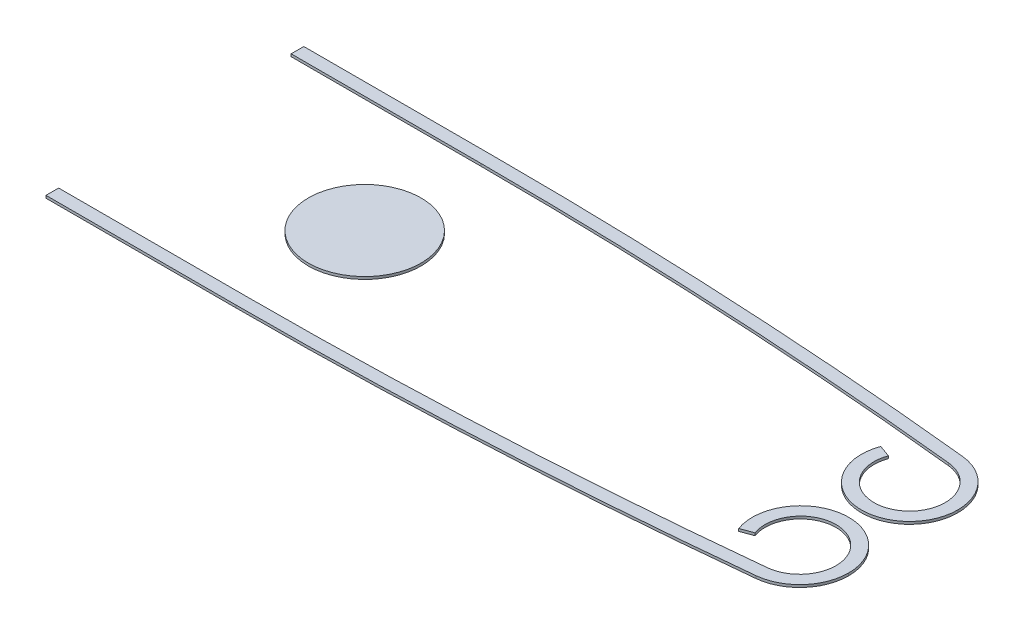
ISO-10303-21;
HEADER;
FILE_DESCRIPTION(('STEP AP214'),'2;1');
FILE_NAME('part.step','',(''),(''),'','','');
FILE_SCHEMA(('AUTOMOTIVE_DESIGN { 1 0 10303 214 1 1 1 1 }'));
ENDSEC;
DATA;
#1=APPLICATION_CONTEXT('core data for automotive mechanical design processes');
#2=APPLICATION_PROTOCOL_DEFINITION('international standard','automotive_design',2000,#1);
#3=PRODUCT_CONTEXT('',#1,'mechanical');
#4=PRODUCT('Part','Part','',(#3));
#5=PRODUCT_RELATED_PRODUCT_CATEGORY('part','',(#4));
#6=PRODUCT_DEFINITION_FORMATION('','',#4);
#7=PRODUCT_DEFINITION_CONTEXT('part definition',#1,'design');
#8=PRODUCT_DEFINITION('design','',#6,#7);
#9=PRODUCT_DEFINITION_SHAPE('','',#8);
#10=(LENGTH_UNIT() NAMED_UNIT(*) SI_UNIT(.MILLI.,.METRE.));
#11=(NAMED_UNIT(*) PLANE_ANGLE_UNIT() SI_UNIT($,.RADIAN.));
#12=(NAMED_UNIT(*) SI_UNIT($,.STERADIAN.) SOLID_ANGLE_UNIT());
#13=UNCERTAINTY_MEASURE_WITH_UNIT(LENGTH_MEASURE(1.E-05),#10,'distance_accuracy_value','');
#14=(GEOMETRIC_REPRESENTATION_CONTEXT(3) GLOBAL_UNCERTAINTY_ASSIGNED_CONTEXT((#13)) GLOBAL_UNIT_ASSIGNED_CONTEXT((#10,
#11,#12)) REPRESENTATION_CONTEXT('',''));
#15=CARTESIAN_POINT('',(0.,0.,0.));
#16=DIRECTION('',(0.,0.,1.));
#17=DIRECTION('',(1.,0.,0.));
#18=AXIS2_PLACEMENT_3D('',#15,#16,#17);
#19=CARTESIAN_POINT('',(193.75,0.5,21.55));
#20=DIRECTION('',(0.,-1.,0.));
#21=DIRECTION('',(0.,0.,-1.));
#22=AXIS2_PLACEMENT_3D('',#19,#20,#21);
#23=CYLINDRICAL_SURFACE('',#22,19.05);
#24=CARTESIAN_POINT('',(193.75,-0.5,21.55));
#25=DIRECTION('',(0.,1.,0.));
#26=DIRECTION('',(0.,0.,1.));
#27=AXIS2_PLACEMENT_3D('',#24,#25,#26);
#28=CIRCLE('',#27,19.05);
#29=CARTESIAN_POINT('',(212.8,-0.5,21.55));
#30=VERTEX_POINT('',#29);
#31=CARTESIAN_POINT('',(175.848518066115,-0.5,28.0645563602443));
#32=VERTEX_POINT('',#31);
#33=EDGE_CURVE('E150',#30,#32,#28,.T.);
#34=ORIENTED_EDGE('',*,*,#33,.T.);
#35=DIRECTION('',(0.,-1.,0.));
#36=VECTOR('',#35,1.);
#37=CARTESIAN_POINT('',(175.848518066115,0.5,28.0645563602443));
#38=LINE('',#37,#36);
#39=CARTESIAN_POINT('',(175.848518066115,0.5,28.0645563602443));
#40=VERTEX_POINT('',#39);
#41=EDGE_CURVE('E12',#40,#32,#38,.T.);
#42=ORIENTED_EDGE('',*,*,#41,.F.);
#43=CARTESIAN_POINT('',(193.75,0.5,21.55));
#44=DIRECTION('',(0.,1.,0.));
#45=DIRECTION('',(0.,0.,1.));
#46=AXIS2_PLACEMENT_3D('',#43,#44,#45);
#47=CIRCLE('',#46,19.05);
#48=CARTESIAN_POINT('',(212.8,0.5,21.55));
#49=VERTEX_POINT('',#48);
#50=EDGE_CURVE('E168',#49,#40,#47,.T.);
#51=ORIENTED_EDGE('',*,*,#50,.F.);
#52=DIRECTION('',(0.,-1.,0.));
#53=VECTOR('',#52,1.);
#54=CARTESIAN_POINT('',(212.8,0.5,21.55));
#55=LINE('',#54,#53);
#56=EDGE_CURVE('E146',#49,#30,#55,.T.);
#57=ORIENTED_EDGE('',*,*,#56,.T.);
#58=EDGE_LOOP('',(#34,#42,#51,#57));
#59=FACE_BOUND('',#58,.T.);
#60=ADVANCED_FACE('F42',(#59),#23,.T.);
#61=CARTESIAN_POINT('',(180.547069754799,0.5,26.3546990478442));
#62=DIRECTION('',(-0.341971462480017,0.,-0.93971033773673));
#63=DIRECTION('',(-0.93971033773673,0.,0.341971462480017));
#64=AXIS2_PLACEMENT_3D('',#61,#62,#63);
#65=PLANE('',#64);
#66=DIRECTION('',(0.93971033773673,0.,-0.341971462480017));
#67=VECTOR('',#66,1.);
#68=CARTESIAN_POINT('',(180.547069754799,-0.5,26.3546990478442));
#69=LINE('',#68,#67);
#70=CARTESIAN_POINT('',(180.547069754799,-0.5,26.3546990478442));
#71=VERTEX_POINT('',#70);
#72=EDGE_CURVE('E153',#32,#71,#69,.T.);
#73=ORIENTED_EDGE('',*,*,#72,.T.);
#74=DIRECTION('',(0.,-1.,0.));
#75=VECTOR('',#74,1.);
#76=CARTESIAN_POINT('',(180.547069754799,0.5,26.3546990478442));
#77=LINE('',#76,#75);
#78=CARTESIAN_POINT('',(180.547069754799,0.5,26.3546990478442));
#79=VERTEX_POINT('',#78);
#80=EDGE_CURVE('E50',#79,#71,#77,.T.);
#81=ORIENTED_EDGE('',*,*,#80,.F.);
#82=DIRECTION('',(0.93971033773673,0.,-0.341971462480017));
#83=VECTOR('',#82,1.);
#84=CARTESIAN_POINT('',(180.547069754799,0.5,26.3546990478442));
#85=LINE('',#84,#83);
#86=EDGE_CURVE('E107',#40,#79,#85,.T.);
#87=ORIENTED_EDGE('',*,*,#86,.F.);
#88=ORIENTED_EDGE('',*,*,#41,.T.);
#89=EDGE_LOOP('',(#73,#81,#87,#88));
#90=FACE_BOUND('',#89,.T.);
#91=ADVANCED_FACE('F217',(#90),#65,.F.);
#92=CARTESIAN_POINT('',(193.75,0.5,21.55));
#93=DIRECTION('',(0.,-1.,0.));
#94=DIRECTION('',(0.,0.,-1.));
#95=AXIS2_PLACEMENT_3D('',#92,#93,#94);
#96=CYLINDRICAL_SURFACE('',#95,14.05);
#97=CARTESIAN_POINT('',(193.75,-0.5,21.55));
#98=DIRECTION('',(0.,-1.,0.));
#99=DIRECTION('',(0.,0.,1.));
#100=AXIS2_PLACEMENT_3D('',#97,#98,#99);
#101=CIRCLE('',#100,14.05);
#102=CARTESIAN_POINT('',(207.8,-0.5,21.55));
#103=VERTEX_POINT('',#102);
#104=EDGE_CURVE('E155',#71,#103,#101,.T.);
#105=ORIENTED_EDGE('',*,*,#104,.T.);
#106=DIRECTION('',(0.,-1.,0.));
#107=VECTOR('',#106,1.);
#108=CARTESIAN_POINT('',(207.8,0.5,21.55));
#109=LINE('',#108,#107);
#110=CARTESIAN_POINT('',(207.8,0.5,21.55));
#111=VERTEX_POINT('',#110);
#112=EDGE_CURVE('E181',#111,#103,#109,.T.);
#113=ORIENTED_EDGE('',*,*,#112,.F.);
#114=CARTESIAN_POINT('',(193.75,0.5,21.55));
#115=DIRECTION('',(0.,-1.,0.));
#116=DIRECTION('',(0.,0.,1.));
#117=AXIS2_PLACEMENT_3D('',#114,#115,#116);
#118=CIRCLE('',#117,14.05);
#119=EDGE_CURVE('E189',#79,#111,#118,.T.);
#120=ORIENTED_EDGE('',*,*,#119,.F.);
#121=ORIENTED_EDGE('',*,*,#80,.T.);
#122=EDGE_LOOP('',(#105,#113,#120,#121));
#123=FACE_BOUND('',#122,.T.);
#124=ADVANCED_FACE('F187',(#123),#96,.F.);
#125=CARTESIAN_POINT('',(193.442155370501,0.5,21.55));
#126=DIRECTION('',(0.,-1.,0.));
#127=DIRECTION('',(0.,0.,-1.));
#128=AXIS2_PLACEMENT_3D('',#125,#126,#127);
#129=CYLINDRICAL_SURFACE('',#128,14.357844629499);
#130=CARTESIAN_POINT('',(193.442155370501,-0.5,21.55));
#131=DIRECTION('',(0.,-1.,0.));
#132=DIRECTION('',(0.,0.,1.));
#133=AXIS2_PLACEMENT_3D('',#130,#131,#132);
#134=CIRCLE('',#133,14.357844629499);
#135=CARTESIAN_POINT('',(194.926198619889,-0.5,35.830942477259));
#136=VERTEX_POINT('',#135);
#137=EDGE_CURVE('E157',#103,#136,#134,.T.);
#138=ORIENTED_EDGE('',*,*,#137,.T.);
#139=DIRECTION('',(0.,-1.,0.));
#140=VECTOR('',#139,1.);
#141=CARTESIAN_POINT('',(194.926198619889,0.5,35.830942477259));
#142=LINE('',#141,#140);
#143=CARTESIAN_POINT('',(194.926198619889,0.5,35.830942477259));
#144=VERTEX_POINT('',#143);
#145=EDGE_CURVE('E178',#144,#136,#142,.T.);
#146=ORIENTED_EDGE('',*,*,#145,.F.);
#147=CARTESIAN_POINT('',(193.442155370501,0.5,21.55));
#148=DIRECTION('',(0.,-1.,0.));
#149=DIRECTION('',(0.,0.,1.));
#150=AXIS2_PLACEMENT_3D('',#147,#148,#149);
#151=CIRCLE('',#150,14.357844629499);
#152=EDGE_CURVE('E207',#111,#144,#151,.T.);
#153=ORIENTED_EDGE('',*,*,#152,.F.);
#154=ORIENTED_EDGE('',*,*,#112,.T.);
#155=EDGE_LOOP('',(#138,#146,#153,#154));
#156=FACE_BOUND('',#155,.T.);
#157=ADVANCED_FACE('F198',(#156),#129,.F.);
#158=CARTESIAN_POINT('',(0.,0.5,-1839.94311663476));
#159=DIRECTION('',(0.,-1.,0.));
#160=DIRECTION('',(0.,0.,-1.));
#161=AXIS2_PLACEMENT_3D('',#158,#159,#160);
#162=CYLINDRICAL_SURFACE('',#161,1885.87500745568);
#163=CARTESIAN_POINT('',(0.,-0.5,-1839.94311663476));
#164=DIRECTION('',(0.,-1.,0.));
#165=DIRECTION('',(0.,0.,1.));
#166=AXIS2_PLACEMENT_3D('',#163,#164,#165);
#167=CIRCLE('',#166,1885.87500745568);
#168=CARTESIAN_POINT('',(0.,-0.5,45.931890820925));
#169=VERTEX_POINT('',#168);
#170=EDGE_CURVE('E159',#136,#169,#167,.T.);
#171=ORIENTED_EDGE('',*,*,#170,.T.);
#172=DIRECTION('',(0.,-1.,0.));
#173=VECTOR('',#172,1.);
#174=CARTESIAN_POINT('',(0.,0.5,45.931890820925));
#175=LINE('',#174,#173);
#176=CARTESIAN_POINT('',(0.,0.5,45.931890820925));
#177=VERTEX_POINT('',#176);
#178=EDGE_CURVE('E175',#177,#169,#175,.T.);
#179=ORIENTED_EDGE('',*,*,#178,.F.);
#180=CARTESIAN_POINT('',(0.,0.5,-1839.94311663476));
#181=DIRECTION('',(0.,-1.,0.));
#182=DIRECTION('',(0.,0.,1.));
#183=AXIS2_PLACEMENT_3D('',#180,#181,#182);
#184=CIRCLE('',#183,1885.87500745568);
#185=EDGE_CURVE('E204',#144,#177,#184,.T.);
#186=ORIENTED_EDGE('',*,*,#185,.F.);
#187=ORIENTED_EDGE('',*,*,#145,.T.);
#188=EDGE_LOOP('',(#171,#179,#186,#187));
#189=FACE_BOUND('',#188,.T.);
#190=ADVANCED_FACE('F202',(#189),#162,.F.);
#191=CARTESIAN_POINT('',(-3.03271831394858E-13,0.5,45.931890820925));
#192=DIRECTION('',(0.,0.,1.));
#193=DIRECTION('',(1.,0.,0.));
#194=AXIS2_PLACEMENT_3D('',#191,#192,#193);
#195=PLANE('',#194);
#196=DIRECTION('',(-1.,0.,0.));
#197=VECTOR('',#196,1.);
#198=CARTESIAN_POINT('',(-3.03271831394858E-13,-0.5,45.931890820925));
#199=LINE('',#198,#197);
#200=CARTESIAN_POINT('',(-75.0000000000002,-0.5,45.9318908209251));
#201=VERTEX_POINT('',#200);
#202=EDGE_CURVE('E161',#169,#201,#199,.T.);
#203=ORIENTED_EDGE('',*,*,#202,.T.);
#204=DIRECTION('',(0.,-1.,0.));
#205=VECTOR('',#204,1.);
#206=CARTESIAN_POINT('',(-75.0000000000002,0.5,45.9318908209251));
#207=LINE('',#206,#205);
#208=CARTESIAN_POINT('',(-75.0000000000002,0.5,45.9318908209251));
#209=VERTEX_POINT('',#208);
#210=EDGE_CURVE('E172',#209,#201,#207,.T.);
#211=ORIENTED_EDGE('',*,*,#210,.F.);
#212=DIRECTION('',(-1.,0.,0.));
#213=VECTOR('',#212,1.);
#214=CARTESIAN_POINT('',(-3.03271831394858E-13,0.5,45.931890820925));
#215=LINE('',#214,#213);
#216=EDGE_CURVE('E206',#177,#209,#215,.T.);
#217=ORIENTED_EDGE('',*,*,#216,.F.);
#218=ORIENTED_EDGE('',*,*,#178,.T.);
#219=EDGE_LOOP('',(#203,#211,#217,#218));
#220=FACE_BOUND('',#219,.T.);
#221=ADVANCED_FACE('F229',(#220),#195,.F.);
#222=CARTESIAN_POINT('',(-75.0000000000002,0.5,50.9318908209252));
#223=DIRECTION('',(1.,0.,0.));
#224=DIRECTION('',(0.,0.,-1.));
#225=AXIS2_PLACEMENT_3D('',#222,#223,#224);
#226=PLANE('',#225);
#227=DIRECTION('',(0.,0.,1.));
#228=VECTOR('',#227,1.);
#229=CARTESIAN_POINT('',(-75.0000000000002,-0.5,50.9318908209252));
#230=LINE('',#229,#228);
#231=CARTESIAN_POINT('',(-75.0000000000002,-0.5,50.9318908209252));
#232=VERTEX_POINT('',#231);
#233=EDGE_CURVE('E163',#201,#232,#230,.T.);
#234=ORIENTED_EDGE('',*,*,#233,.T.);
#235=DIRECTION('',(0.,-1.,0.));
#236=VECTOR('',#235,1.);
#237=CARTESIAN_POINT('',(-75.0000000000002,0.5,50.9318908209252));
#238=LINE('',#237,#236);
#239=CARTESIAN_POINT('',(-75.0000000000002,0.5,50.9318908209252));
#240=VERTEX_POINT('',#239);
#241=EDGE_CURVE('E141',#240,#232,#238,.T.);
#242=ORIENTED_EDGE('',*,*,#241,.F.);
#243=DIRECTION('',(0.,0.,1.));
#244=VECTOR('',#243,1.);
#245=CARTESIAN_POINT('',(-75.0000000000002,0.5,50.9318908209252));
#246=LINE('',#245,#244);
#247=EDGE_CURVE('E132',#209,#240,#246,.T.);
#248=ORIENTED_EDGE('',*,*,#247,.F.);
#249=ORIENTED_EDGE('',*,*,#210,.T.);
#250=EDGE_LOOP('',(#234,#242,#248,#249));
#251=FACE_BOUND('',#250,.T.);
#252=ADVANCED_FACE('F232',(#251),#226,.F.);
#253=CARTESIAN_POINT('',(-2.31565402546833E-13,0.5,50.9318908209251));
#254=DIRECTION('',(0.,0.,-1.));
#255=DIRECTION('',(-1.,0.,0.));
#256=AXIS2_PLACEMENT_3D('',#253,#254,#255);
#257=PLANE('',#256);
#258=DIRECTION('',(1.,0.,0.));
#259=VECTOR('',#258,1.);
#260=CARTESIAN_POINT('',(-2.31565402546833E-13,-0.5,50.9318908209251));
#261=LINE('',#260,#259);
#262=CARTESIAN_POINT('',(-2.31565402546833E-13,-0.5,50.9318908209251));
#263=VERTEX_POINT('',#262);
#264=EDGE_CURVE('E140',#232,#263,#261,.T.);
#265=ORIENTED_EDGE('',*,*,#264,.T.);
#266=DIRECTION('',(0.,-1.,0.));
#267=VECTOR('',#266,1.);
#268=CARTESIAN_POINT('',(-2.31565402546833E-13,0.5,50.9318908209251));
#269=LINE('',#268,#267);
#270=CARTESIAN_POINT('',(-2.31565402546833E-13,0.5,50.9318908209251));
#271=VERTEX_POINT('',#270);
#272=EDGE_CURVE('E137',#271,#263,#269,.T.);
#273=ORIENTED_EDGE('',*,*,#272,.F.);
#274=DIRECTION('',(1.,0.,0.));
#275=VECTOR('',#274,1.);
#276=CARTESIAN_POINT('',(-2.31565402546833E-13,0.5,50.9318908209251));
#277=LINE('',#276,#275);
#278=EDGE_CURVE('E126',#240,#271,#277,.T.);
#279=ORIENTED_EDGE('',*,*,#278,.F.);
#280=ORIENTED_EDGE('',*,*,#241,.T.);
#281=EDGE_LOOP('',(#265,#273,#279,#280));
#282=FACE_BOUND('',#281,.T.);
#283=ADVANCED_FACE('F138',(#282),#257,.F.);
#284=CARTESIAN_POINT('',(0.,0.5,-1839.94311663476));
#285=DIRECTION('',(0.,-1.,0.));
#286=DIRECTION('',(0.,0.,-1.));
#287=AXIS2_PLACEMENT_3D('',#284,#285,#286);
#288=CYLINDRICAL_SURFACE('',#287,1890.87500745568);
#289=CARTESIAN_POINT('',(0.,-0.5,-1839.94311663476));
#290=DIRECTION('',(0.,1.,0.));
#291=DIRECTION('',(0.,0.,1.));
#292=AXIS2_PLACEMENT_3D('',#289,#290,#291);
#293=CIRCLE('',#292,1890.87500745568);
#294=CARTESIAN_POINT('',(195.443004340971,-0.5,40.8041619422186));
#295=VERTEX_POINT('',#294);
#296=EDGE_CURVE('E93',#263,#295,#293,.T.);
#297=ORIENTED_EDGE('',*,*,#296,.T.);
#298=DIRECTION('',(0.,-1.,0.));
#299=VECTOR('',#298,1.);
#300=CARTESIAN_POINT('',(195.443004340971,0.5,40.8041619422186));
#301=LINE('',#300,#299);
#302=CARTESIAN_POINT('',(195.443004340971,0.5,40.8041619422186));
#303=VERTEX_POINT('',#302);
#304=EDGE_CURVE('E142',#303,#295,#301,.T.);
#305=ORIENTED_EDGE('',*,*,#304,.F.);
#306=CARTESIAN_POINT('',(0.,0.5,-1839.94311663476));
#307=DIRECTION('',(0.,1.,0.));
#308=DIRECTION('',(0.,0.,1.));
#309=AXIS2_PLACEMENT_3D('',#306,#307,#308);
#310=CIRCLE('',#309,1890.87500745568);
#311=EDGE_CURVE('E130',#271,#303,#310,.T.);
#312=ORIENTED_EDGE('',*,*,#311,.F.);
#313=ORIENTED_EDGE('',*,*,#272,.T.);
#314=EDGE_LOOP('',(#297,#305,#312,#313));
#315=FACE_BOUND('',#314,.T.);
#316=ADVANCED_FACE('F144',(#315),#288,.T.);
#317=CARTESIAN_POINT('',(193.442155370501,0.5,21.55));
#318=DIRECTION('',(0.,-1.,0.));
#319=DIRECTION('',(0.,0.,-1.));
#320=AXIS2_PLACEMENT_3D('',#317,#318,#319);
#321=CYLINDRICAL_SURFACE('',#320,19.3578446294989);
#322=CARTESIAN_POINT('',(193.442155370501,-0.5,21.55));
#323=DIRECTION('',(0.,1.,0.));
#324=DIRECTION('',(0.,0.,1.));
#325=AXIS2_PLACEMENT_3D('',#322,#323,#324);
#326=CIRCLE('',#325,19.3578446294989);
#327=EDGE_CURVE('E99',#295,#30,#326,.T.);
#328=ORIENTED_EDGE('',*,*,#327,.T.);
#329=ORIENTED_EDGE('',*,*,#56,.F.);
#330=CARTESIAN_POINT('',(193.442155370501,0.5,21.55));
#331=DIRECTION('',(0.,1.,0.));
#332=DIRECTION('',(0.,0.,1.));
#333=AXIS2_PLACEMENT_3D('',#330,#331,#332);
#334=CIRCLE('',#333,19.3578446294989);
#335=EDGE_CURVE('E58',#303,#49,#334,.T.);
#336=ORIENTED_EDGE('',*,*,#335,.F.);
#337=ORIENTED_EDGE('',*,*,#304,.T.);
#338=EDGE_LOOP('',(#328,#329,#336,#337));
#339=FACE_BOUND('',#338,.T.);
#340=ADVANCED_FACE('F241',(#339),#321,.T.);
#341=CARTESIAN_POINT('',(193.75,0.5,21.55));
#342=DIRECTION('',(0.,1.,0.));
#343=DIRECTION('',(0.,0.,1.));
#344=AXIS2_PLACEMENT_3D('',#341,#342,#343);
#345=PLANE('',#344);
#346=ORIENTED_EDGE('',*,*,#50,.T.);
#347=ORIENTED_EDGE('',*,*,#86,.T.);
#348=ORIENTED_EDGE('',*,*,#119,.T.);
#349=ORIENTED_EDGE('',*,*,#152,.T.);
#350=ORIENTED_EDGE('',*,*,#185,.T.);
#351=ORIENTED_EDGE('',*,*,#216,.T.);
#352=ORIENTED_EDGE('',*,*,#247,.T.);
#353=ORIENTED_EDGE('',*,*,#278,.T.);
#354=ORIENTED_EDGE('',*,*,#311,.T.);
#355=ORIENTED_EDGE('',*,*,#335,.T.);
#356=EDGE_LOOP('',(#346,#347,#348,#349,#350,#351,#352,#353,#354,#355));
#357=FACE_BOUND('',#356,.T.);
#358=ADVANCED_FACE('F128',(#357),#345,.T.);
#359=CARTESIAN_POINT('',(193.75,-0.5,21.55));
#360=DIRECTION('',(0.,1.,0.));
#361=DIRECTION('',(0.,0.,1.));
#362=AXIS2_PLACEMENT_3D('',#359,#360,#361);
#363=PLANE('',#362);
#364=ORIENTED_EDGE('',*,*,#33,.F.);
#365=ORIENTED_EDGE('',*,*,#327,.F.);
#366=ORIENTED_EDGE('',*,*,#296,.F.);
#367=ORIENTED_EDGE('',*,*,#264,.F.);
#368=ORIENTED_EDGE('',*,*,#233,.F.);
#369=ORIENTED_EDGE('',*,*,#202,.F.);
#370=ORIENTED_EDGE('',*,*,#170,.F.);
#371=ORIENTED_EDGE('',*,*,#137,.F.);
#372=ORIENTED_EDGE('',*,*,#104,.F.);
#373=ORIENTED_EDGE('',*,*,#72,.F.);
#374=EDGE_LOOP('',(#364,#365,#366,#367,#368,#369,#370,#371,#372,#373));
#375=FACE_BOUND('',#374,.T.);
#376=ADVANCED_FACE('F193',(#375),#363,.F.);
#377=CLOSED_SHELL('',(#60,#91,#124,#157,#190,#221,#252,#283,#316,#340,#358,#376));
#378=MANIFOLD_SOLID_BREP('B2',#377);
#379=CARTESIAN_POINT('',(0.,0.5,1839.94311663476));
#380=DIRECTION('',(0.,-1.,0.));
#381=DIRECTION('',(0.,0.,-1.));
#382=AXIS2_PLACEMENT_3D('',#379,#380,#381);
#383=CYLINDRICAL_SURFACE('',#382,1890.87500745568);
#384=CARTESIAN_POINT('',(0.,-0.5,1839.94311663476));
#385=DIRECTION('',(0.,1.,0.));
#386=DIRECTION('',(0.,0.,-1.));
#387=AXIS2_PLACEMENT_3D('',#384,#385,#386);
#388=CIRCLE('',#387,1890.87500745568);
#389=CARTESIAN_POINT('',(195.443004340971,-0.5,-40.8041619422188));
#390=VERTEX_POINT('',#389);
#391=CARTESIAN_POINT('',(-2.31565402546833E-13,-0.5,-50.9318908209251));
#392=VERTEX_POINT('',#391);
#393=EDGE_CURVE('E437',#390,#392,#388,.T.);
#394=ORIENTED_EDGE('',*,*,#393,.T.);
#395=DIRECTION('',(0.,-1.,0.));
#396=VECTOR('',#395,1.);
#397=CARTESIAN_POINT('',(-2.31565402546833E-13,0.5,-50.9318908209251));
#398=LINE('',#397,#396);
#399=CARTESIAN_POINT('',(-2.31565402546833E-13,0.5,-50.9318908209251));
#400=VERTEX_POINT('',#399);
#401=EDGE_CURVE('E40',#400,#392,#398,.T.);
#402=ORIENTED_EDGE('',*,*,#401,.F.);
#403=CARTESIAN_POINT('',(0.,0.5,1839.94311663476));
#404=DIRECTION('',(0.,1.,0.));
#405=DIRECTION('',(0.,0.,-1.));
#406=AXIS2_PLACEMENT_3D('',#403,#404,#405);
#407=CIRCLE('',#406,1890.87500745568);
#408=CARTESIAN_POINT('',(195.443004340971,0.5,-40.8041619422188));
#409=VERTEX_POINT('',#408);
#410=EDGE_CURVE('E455',#409,#400,#407,.T.);
#411=ORIENTED_EDGE('',*,*,#410,.F.);
#412=DIRECTION('',(0.,-1.,0.));
#413=VECTOR('',#412,1.);
#414=CARTESIAN_POINT('',(195.443004340971,0.5,-40.8041619422188));
#415=LINE('',#414,#413);
#416=EDGE_CURVE('E433',#409,#390,#415,.T.);
#417=ORIENTED_EDGE('',*,*,#416,.T.);
#418=EDGE_LOOP('',(#394,#402,#411,#417));
#419=FACE_BOUND('',#418,.T.);
#420=ADVANCED_FACE('F329',(#419),#383,.T.);
#421=CARTESIAN_POINT('',(-2.31565402546833E-13,0.5,-50.9318908209251));
#422=DIRECTION('',(0.,0.,1.));
#423=DIRECTION('',(1.,0.,0.));
#424=AXIS2_PLACEMENT_3D('',#421,#422,#423);
#425=PLANE('',#424);
#426=DIRECTION('',(-1.,0.,0.));
#427=VECTOR('',#426,1.);
#428=CARTESIAN_POINT('',(-2.31565402546833E-13,-0.5,-50.9318908209251));
#429=LINE('',#428,#427);
#430=CARTESIAN_POINT('',(-75.0000000000002,-0.5,-50.9318908209252));
#431=VERTEX_POINT('',#430);
#432=EDGE_CURVE('E440',#392,#431,#429,.T.);
#433=ORIENTED_EDGE('',*,*,#432,.T.);
#434=DIRECTION('',(0.,-1.,0.));
#435=VECTOR('',#434,1.);
#436=CARTESIAN_POINT('',(-75.0000000000002,0.5,-50.9318908209252));
#437=LINE('',#436,#435);
#438=CARTESIAN_POINT('',(-75.0000000000002,0.5,-50.9318908209252));
#439=VERTEX_POINT('',#438);
#440=EDGE_CURVE('E337',#439,#431,#437,.T.);
#441=ORIENTED_EDGE('',*,*,#440,.F.);
#442=DIRECTION('',(-1.,0.,0.));
#443=VECTOR('',#442,1.);
#444=CARTESIAN_POINT('',(-2.31565402546833E-13,0.5,-50.9318908209251));
#445=LINE('',#444,#443);
#446=EDGE_CURVE('E394',#400,#439,#445,.T.);
#447=ORIENTED_EDGE('',*,*,#446,.F.);
#448=ORIENTED_EDGE('',*,*,#401,.T.);
#449=EDGE_LOOP('',(#433,#441,#447,#448));
#450=FACE_BOUND('',#449,.T.);
#451=ADVANCED_FACE('F504',(#450),#425,.F.);
#452=CARTESIAN_POINT('',(-75.0000000000002,0.5,-50.9318908209252));
#453=DIRECTION('',(1.,0.,0.));
#454=DIRECTION('',(0.,0.,-1.));
#455=AXIS2_PLACEMENT_3D('',#452,#453,#454);
#456=PLANE('',#455);
#457=DIRECTION('',(0.,0.,1.));
#458=VECTOR('',#457,1.);
#459=CARTESIAN_POINT('',(-75.0000000000002,-0.5,-50.9318908209252));
#460=LINE('',#459,#458);
#461=CARTESIAN_POINT('',(-75.0000000000002,-0.5,-45.9318908209251));
#462=VERTEX_POINT('',#461);
#463=EDGE_CURVE('E442',#431,#462,#460,.T.);
#464=ORIENTED_EDGE('',*,*,#463,.T.);
#465=DIRECTION('',(0.,-1.,0.));
#466=VECTOR('',#465,1.);
#467=CARTESIAN_POINT('',(-75.0000000000002,0.5,-45.9318908209251));
#468=LINE('',#467,#466);
#469=CARTESIAN_POINT('',(-75.0000000000002,0.5,-45.9318908209251));
#470=VERTEX_POINT('',#469);
#471=EDGE_CURVE('E468',#470,#462,#468,.T.);
#472=ORIENTED_EDGE('',*,*,#471,.F.);
#473=DIRECTION('',(0.,0.,1.));
#474=VECTOR('',#473,1.);
#475=CARTESIAN_POINT('',(-75.0000000000002,0.5,-50.9318908209252));
#476=LINE('',#475,#474);
#477=EDGE_CURVE('E476',#439,#470,#476,.T.);
#478=ORIENTED_EDGE('',*,*,#477,.F.);
#479=ORIENTED_EDGE('',*,*,#440,.T.);
#480=EDGE_LOOP('',(#464,#472,#478,#479));
#481=FACE_BOUND('',#480,.T.);
#482=ADVANCED_FACE('F474',(#481),#456,.F.);
#483=CARTESIAN_POINT('',(-3.03271831394858E-13,0.5,-45.931890820925));
#484=DIRECTION('',(0.,0.,-1.));
#485=DIRECTION('',(-1.,0.,0.));
#486=AXIS2_PLACEMENT_3D('',#483,#484,#485);
#487=PLANE('',#486);
#488=DIRECTION('',(1.,0.,0.));
#489=VECTOR('',#488,1.);
#490=CARTESIAN_POINT('',(-3.03271831394858E-13,-0.5,-45.931890820925));
#491=LINE('',#490,#489);
#492=CARTESIAN_POINT('',(-3.03271831394858E-13,-0.5,-45.931890820925));
#493=VERTEX_POINT('',#492);
#494=EDGE_CURVE('E444',#462,#493,#491,.T.);
#495=ORIENTED_EDGE('',*,*,#494,.T.);
#496=DIRECTION('',(0.,-1.,0.));
#497=VECTOR('',#496,1.);
#498=CARTESIAN_POINT('',(-3.03271831394858E-13,0.5,-45.931890820925));
#499=LINE('',#498,#497);
#500=CARTESIAN_POINT('',(-3.03271831394858E-13,0.5,-45.931890820925));
#501=VERTEX_POINT('',#500);
#502=EDGE_CURVE('E465',#501,#493,#499,.T.);
#503=ORIENTED_EDGE('',*,*,#502,.F.);
#504=DIRECTION('',(1.,0.,0.));
#505=VECTOR('',#504,1.);
#506=CARTESIAN_POINT('',(-3.03271831394858E-13,0.5,-45.931890820925));
#507=LINE('',#506,#505);
#508=EDGE_CURVE('E494',#470,#501,#507,.T.);
#509=ORIENTED_EDGE('',*,*,#508,.F.);
#510=ORIENTED_EDGE('',*,*,#471,.T.);
#511=EDGE_LOOP('',(#495,#503,#509,#510));
#512=FACE_BOUND('',#511,.T.);
#513=ADVANCED_FACE('F485',(#512),#487,.F.);
#514=CARTESIAN_POINT('',(0.,0.5,1839.94311663476));
#515=DIRECTION('',(0.,-1.,0.));
#516=DIRECTION('',(0.,0.,-1.));
#517=AXIS2_PLACEMENT_3D('',#514,#515,#516);
#518=CYLINDRICAL_SURFACE('',#517,1885.87500745568);
#519=CARTESIAN_POINT('',(0.,-0.5,1839.94311663476));
#520=DIRECTION('',(0.,-1.,0.));
#521=DIRECTION('',(0.,0.,-1.));
#522=AXIS2_PLACEMENT_3D('',#519,#520,#521);
#523=CIRCLE('',#522,1885.87500745568);
#524=CARTESIAN_POINT('',(194.926198619889,-0.5,-35.8309424772587));
#525=VERTEX_POINT('',#524);
#526=EDGE_CURVE('E446',#493,#525,#523,.T.);
#527=ORIENTED_EDGE('',*,*,#526,.T.);
#528=DIRECTION('',(0.,-1.,0.));
#529=VECTOR('',#528,1.);
#530=CARTESIAN_POINT('',(194.926198619889,0.5,-35.8309424772587));
#531=LINE('',#530,#529);
#532=CARTESIAN_POINT('',(194.926198619889,0.5,-35.8309424772587));
#533=VERTEX_POINT('',#532);
#534=EDGE_CURVE('E462',#533,#525,#531,.T.);
#535=ORIENTED_EDGE('',*,*,#534,.F.);
#536=CARTESIAN_POINT('',(0.,0.5,1839.94311663476));
#537=DIRECTION('',(0.,-1.,0.));
#538=DIRECTION('',(0.,0.,-1.));
#539=AXIS2_PLACEMENT_3D('',#536,#537,#538);
#540=CIRCLE('',#539,1885.87500745568);
#541=EDGE_CURVE('E491',#501,#533,#540,.T.);
#542=ORIENTED_EDGE('',*,*,#541,.F.);
#543=ORIENTED_EDGE('',*,*,#502,.T.);
#544=EDGE_LOOP('',(#527,#535,#542,#543));
#545=FACE_BOUND('',#544,.T.);
#546=ADVANCED_FACE('F489',(#545),#518,.F.);
#547=CARTESIAN_POINT('',(193.442155370501,0.5,-21.55));
#548=DIRECTION('',(0.,-1.,0.));
#549=DIRECTION('',(0.,0.,-1.));
#550=AXIS2_PLACEMENT_3D('',#547,#548,#549);
#551=CYLINDRICAL_SURFACE('',#550,14.357844629499);
#552=CARTESIAN_POINT('',(193.442155370501,-0.5,-21.55));
#553=DIRECTION('',(0.,-1.,0.));
#554=DIRECTION('',(0.,0.,-1.));
#555=AXIS2_PLACEMENT_3D('',#552,#553,#554);
#556=CIRCLE('',#555,14.357844629499);
#557=CARTESIAN_POINT('',(207.8,-0.5,-21.55));
#558=VERTEX_POINT('',#557);
#559=EDGE_CURVE('E448',#525,#558,#556,.T.);
#560=ORIENTED_EDGE('',*,*,#559,.T.);
#561=DIRECTION('',(0.,-1.,0.));
#562=VECTOR('',#561,1.);
#563=CARTESIAN_POINT('',(207.8,0.5,-21.55));
#564=LINE('',#563,#562);
#565=CARTESIAN_POINT('',(207.8,0.5,-21.55));
#566=VERTEX_POINT('',#565);
#567=EDGE_CURVE('E459',#566,#558,#564,.T.);
#568=ORIENTED_EDGE('',*,*,#567,.F.);
#569=CARTESIAN_POINT('',(193.442155370501,0.5,-21.55));
#570=DIRECTION('',(0.,-1.,0.));
#571=DIRECTION('',(0.,0.,-1.));
#572=AXIS2_PLACEMENT_3D('',#569,#570,#571);
#573=CIRCLE('',#572,14.357844629499);
#574=EDGE_CURVE('E493',#533,#566,#573,.T.);
#575=ORIENTED_EDGE('',*,*,#574,.F.);
#576=ORIENTED_EDGE('',*,*,#534,.T.);
#577=EDGE_LOOP('',(#560,#568,#575,#576));
#578=FACE_BOUND('',#577,.T.);
#579=ADVANCED_FACE('F516',(#578),#551,.F.);
#580=CARTESIAN_POINT('',(193.75,0.5,-21.55));
#581=DIRECTION('',(0.,-1.,0.));
#582=DIRECTION('',(0.,0.,-1.));
#583=AXIS2_PLACEMENT_3D('',#580,#581,#582);
#584=CYLINDRICAL_SURFACE('',#583,14.05);
#585=CARTESIAN_POINT('',(193.75,-0.5,-21.55));
#586=DIRECTION('',(0.,-1.,0.));
#587=DIRECTION('',(0.,0.,-1.));
#588=AXIS2_PLACEMENT_3D('',#585,#586,#587);
#589=CIRCLE('',#588,14.05);
#590=CARTESIAN_POINT('',(180.547069754799,-0.5,-26.3546990478442));
#591=VERTEX_POINT('',#590);
#592=EDGE_CURVE('E450',#558,#591,#589,.T.);
#593=ORIENTED_EDGE('',*,*,#592,.T.);
#594=DIRECTION('',(0.,-1.,0.));
#595=VECTOR('',#594,1.);
#596=CARTESIAN_POINT('',(180.547069754799,0.5,-26.3546990478442));
#597=LINE('',#596,#595);
#598=CARTESIAN_POINT('',(180.547069754799,0.5,-26.3546990478442));
#599=VERTEX_POINT('',#598);
#600=EDGE_CURVE('E428',#599,#591,#597,.T.);
#601=ORIENTED_EDGE('',*,*,#600,.F.);
#602=CARTESIAN_POINT('',(193.75,0.5,-21.55));
#603=DIRECTION('',(0.,-1.,0.));
#604=DIRECTION('',(0.,0.,-1.));
#605=AXIS2_PLACEMENT_3D('',#602,#603,#604);
#606=CIRCLE('',#605,14.05);
#607=EDGE_CURVE('E419',#566,#599,#606,.T.);
#608=ORIENTED_EDGE('',*,*,#607,.F.);
#609=ORIENTED_EDGE('',*,*,#567,.T.);
#610=EDGE_LOOP('',(#593,#601,#608,#609));
#611=FACE_BOUND('',#610,.T.);
#612=ADVANCED_FACE('F519',(#611),#584,.F.);
#613=CARTESIAN_POINT('',(180.547069754799,0.5,-26.3546990478442));
#614=DIRECTION('',(-0.341971462480017,0.,0.93971033773673));
#615=DIRECTION('',(0.93971033773673,0.,0.341971462480017));
#616=AXIS2_PLACEMENT_3D('',#613,#614,#615);
#617=PLANE('',#616);
#618=DIRECTION('',(-0.93971033773673,0.,-0.341971462480017));
#619=VECTOR('',#618,1.);
#620=CARTESIAN_POINT('',(180.547069754799,-0.5,-26.3546990478442));
#621=LINE('',#620,#619);
#622=CARTESIAN_POINT('',(175.848518066115,-0.5,-28.0645563602443));
#623=VERTEX_POINT('',#622);
#624=EDGE_CURVE('E427',#591,#623,#621,.T.);
#625=ORIENTED_EDGE('',*,*,#624,.T.);
#626=DIRECTION('',(0.,-1.,0.));
#627=VECTOR('',#626,1.);
#628=CARTESIAN_POINT('',(175.848518066115,0.5,-28.0645563602443));
#629=LINE('',#628,#627);
#630=CARTESIAN_POINT('',(175.848518066115,0.5,-28.0645563602443));
#631=VERTEX_POINT('',#630);
#632=EDGE_CURVE('E424',#631,#623,#629,.T.);
#633=ORIENTED_EDGE('',*,*,#632,.F.);
#634=DIRECTION('',(-0.93971033773673,0.,-0.341971462480017));
#635=VECTOR('',#634,1.);
#636=CARTESIAN_POINT('',(180.547069754799,0.5,-26.3546990478442));
#637=LINE('',#636,#635);
#638=EDGE_CURVE('E413',#599,#631,#637,.T.);
#639=ORIENTED_EDGE('',*,*,#638,.F.);
#640=ORIENTED_EDGE('',*,*,#600,.T.);
#641=EDGE_LOOP('',(#625,#633,#639,#640));
#642=FACE_BOUND('',#641,.T.);
#643=ADVANCED_FACE('F425',(#642),#617,.F.);
#644=CARTESIAN_POINT('',(193.75,0.5,-21.55));
#645=DIRECTION('',(0.,-1.,0.));
#646=DIRECTION('',(0.,0.,-1.));
#647=AXIS2_PLACEMENT_3D('',#644,#645,#646);
#648=CYLINDRICAL_SURFACE('',#647,19.05);
#649=CARTESIAN_POINT('',(193.75,-0.5,-21.55));
#650=DIRECTION('',(0.,1.,0.));
#651=DIRECTION('',(0.,0.,-1.));
#652=AXIS2_PLACEMENT_3D('',#649,#650,#651);
#653=CIRCLE('',#652,19.05);
#654=CARTESIAN_POINT('',(212.8,-0.5,-21.55));
#655=VERTEX_POINT('',#654);
#656=EDGE_CURVE('E380',#623,#655,#653,.T.);
#657=ORIENTED_EDGE('',*,*,#656,.T.);
#658=DIRECTION('',(0.,-1.,0.));
#659=VECTOR('',#658,1.);
#660=CARTESIAN_POINT('',(212.8,0.5,-21.55));
#661=LINE('',#660,#659);
#662=CARTESIAN_POINT('',(212.8,0.5,-21.55));
#663=VERTEX_POINT('',#662);
#664=EDGE_CURVE('E429',#663,#655,#661,.T.);
#665=ORIENTED_EDGE('',*,*,#664,.F.);
#666=CARTESIAN_POINT('',(193.75,0.5,-21.55));
#667=DIRECTION('',(0.,1.,0.));
#668=DIRECTION('',(0.,0.,-1.));
#669=AXIS2_PLACEMENT_3D('',#666,#667,#668);
#670=CIRCLE('',#669,19.05);
#671=EDGE_CURVE('E417',#631,#663,#670,.T.);
#672=ORIENTED_EDGE('',*,*,#671,.F.);
#673=ORIENTED_EDGE('',*,*,#632,.T.);
#674=EDGE_LOOP('',(#657,#665,#672,#673));
#675=FACE_BOUND('',#674,.T.);
#676=ADVANCED_FACE('F431',(#675),#648,.T.);
#677=CARTESIAN_POINT('',(193.442155370501,0.5,-21.55));
#678=DIRECTION('',(0.,-1.,0.));
#679=DIRECTION('',(0.,0.,-1.));
#680=AXIS2_PLACEMENT_3D('',#677,#678,#679);
#681=CYLINDRICAL_SURFACE('',#680,19.3578446294989);
#682=CARTESIAN_POINT('',(193.442155370501,-0.5,-21.55));
#683=DIRECTION('',(0.,1.,0.));
#684=DIRECTION('',(0.,0.,-1.));
#685=AXIS2_PLACEMENT_3D('',#682,#683,#684);
#686=CIRCLE('',#685,19.3578446294989);
#687=EDGE_CURVE('E386',#655,#390,#686,.T.);
#688=ORIENTED_EDGE('',*,*,#687,.T.);
#689=ORIENTED_EDGE('',*,*,#416,.F.);
#690=CARTESIAN_POINT('',(193.442155370501,0.5,-21.55));
#691=DIRECTION('',(0.,1.,0.));
#692=DIRECTION('',(0.,0.,-1.));
#693=AXIS2_PLACEMENT_3D('',#690,#691,#692);
#694=CIRCLE('',#693,19.3578446294989);
#695=EDGE_CURVE('E345',#663,#409,#694,.T.);
#696=ORIENTED_EDGE('',*,*,#695,.F.);
#697=ORIENTED_EDGE('',*,*,#664,.T.);
#698=EDGE_LOOP('',(#688,#689,#696,#697));
#699=FACE_BOUND('',#698,.T.);
#700=ADVANCED_FACE('F528',(#699),#681,.T.);
#701=CARTESIAN_POINT('',(0.,0.5,1839.94311663476));
#702=DIRECTION('',(0.,-1.,0.));
#703=DIRECTION('',(0.,0.,-1.));
#704=AXIS2_PLACEMENT_3D('',#701,#702,#703);
#705=PLANE('',#704);
#706=ORIENTED_EDGE('',*,*,#410,.T.);
#707=ORIENTED_EDGE('',*,*,#446,.T.);
#708=ORIENTED_EDGE('',*,*,#477,.T.);
#709=ORIENTED_EDGE('',*,*,#508,.T.);
#710=ORIENTED_EDGE('',*,*,#541,.T.);
#711=ORIENTED_EDGE('',*,*,#574,.T.);
#712=ORIENTED_EDGE('',*,*,#607,.T.);
#713=ORIENTED_EDGE('',*,*,#638,.T.);
#714=ORIENTED_EDGE('',*,*,#671,.T.);
#715=ORIENTED_EDGE('',*,*,#695,.T.);
#716=EDGE_LOOP('',(#706,#707,#708,#709,#710,#711,#712,#713,#714,#715));
#717=FACE_BOUND('',#716,.T.);
#718=ADVANCED_FACE('F415',(#717),#705,.F.);
#719=CARTESIAN_POINT('',(0.,-0.5,1839.94311663476));
#720=DIRECTION('',(0.,-1.,0.));
#721=DIRECTION('',(0.,0.,-1.));
#722=AXIS2_PLACEMENT_3D('',#719,#720,#721);
#723=PLANE('',#722);
#724=ORIENTED_EDGE('',*,*,#393,.F.);
#725=ORIENTED_EDGE('',*,*,#687,.F.);
#726=ORIENTED_EDGE('',*,*,#656,.F.);
#727=ORIENTED_EDGE('',*,*,#624,.F.);
#728=ORIENTED_EDGE('',*,*,#592,.F.);
#729=ORIENTED_EDGE('',*,*,#559,.F.);
#730=ORIENTED_EDGE('',*,*,#526,.F.);
#731=ORIENTED_EDGE('',*,*,#494,.F.);
#732=ORIENTED_EDGE('',*,*,#463,.F.);
#733=ORIENTED_EDGE('',*,*,#432,.F.);
#734=EDGE_LOOP('',(#724,#725,#726,#727,#728,#729,#730,#731,#732,#733));
#735=FACE_BOUND('',#734,.T.);
#736=ADVANCED_FACE('F480',(#735),#723,.T.);
#737=CLOSED_SHELL('',(#420,#451,#482,#513,#546,#579,#612,#643,#676,#700,#718,#736));
#738=MANIFOLD_SOLID_BREP('B6',#737);
#739=CARTESIAN_POINT('',(0.,0.5,0.));
#740=DIRECTION('',(0.,-1.,0.));
#741=DIRECTION('',(0.,0.,-1.));
#742=AXIS2_PLACEMENT_3D('',#739,#740,#741);
#743=CYLINDRICAL_SURFACE('',#742,22.3);
#744=CARTESIAN_POINT('',(0.,0.5,0.));
#745=DIRECTION('',(0.,1.,0.));
#746=DIRECTION('',(0.,0.,1.));
#747=AXIS2_PLACEMENT_3D('',#744,#745,#746);
#748=CIRCLE('',#747,22.3);
#749=CARTESIAN_POINT('',(0.,0.5,22.3));
#750=VERTEX_POINT('',#749);
#751=EDGE_CURVE('E328',#750,#750,#748,.T.);
#752=ORIENTED_EDGE('',*,*,#751,.F.);
#753=EDGE_LOOP('',(#752));
#754=FACE_BOUND('',#753,.T.);
#755=CARTESIAN_POINT('',(0.,-0.5,0.));
#756=DIRECTION('',(0.,1.,0.));
#757=DIRECTION('',(0.,0.,1.));
#758=AXIS2_PLACEMENT_3D('',#755,#756,#757);
#759=CIRCLE('',#758,22.3);
#760=CARTESIAN_POINT('',(0.,-0.5,22.3));
#761=VERTEX_POINT('',#760);
#762=EDGE_CURVE('E612',#761,#761,#759,.T.);
#763=ORIENTED_EDGE('',*,*,#762,.T.);
#764=EDGE_LOOP('',(#763));
#765=FACE_BOUND('',#764,.T.);
#766=ADVANCED_FACE('F609',(#754,#765),#743,.T.);
#767=CARTESIAN_POINT('',(0.,0.5,0.));
#768=DIRECTION('',(0.,1.,0.));
#769=DIRECTION('',(0.,0.,1.));
#770=AXIS2_PLACEMENT_3D('',#767,#768,#769);
#771=PLANE('',#770);
#772=ORIENTED_EDGE('',*,*,#751,.T.);
#773=EDGE_LOOP('',(#772));
#774=FACE_BOUND('',#773,.T.);
#775=ADVANCED_FACE('F624',(#774),#771,.T.);
#776=CARTESIAN_POINT('',(0.,-0.5,0.));
#777=DIRECTION('',(0.,1.,0.));
#778=DIRECTION('',(0.,0.,1.));
#779=AXIS2_PLACEMENT_3D('',#776,#777,#778);
#780=PLANE('',#779);
#781=ORIENTED_EDGE('',*,*,#762,.F.);
#782=EDGE_LOOP('',(#781));
#783=FACE_BOUND('',#782,.T.);
#784=ADVANCED_FACE('F622',(#783),#780,.F.);
#785=CLOSED_SHELL('',(#766,#775,#784));
#786=MANIFOLD_SOLID_BREP('B34',#785);
#787=ADVANCED_BREP_SHAPE_REPRESENTATION('',(#18,#378,#738,#786),#14);
#788=SHAPE_DEFINITION_REPRESENTATION(#9,#787);
ENDSEC;
END-ISO-10303-21;
